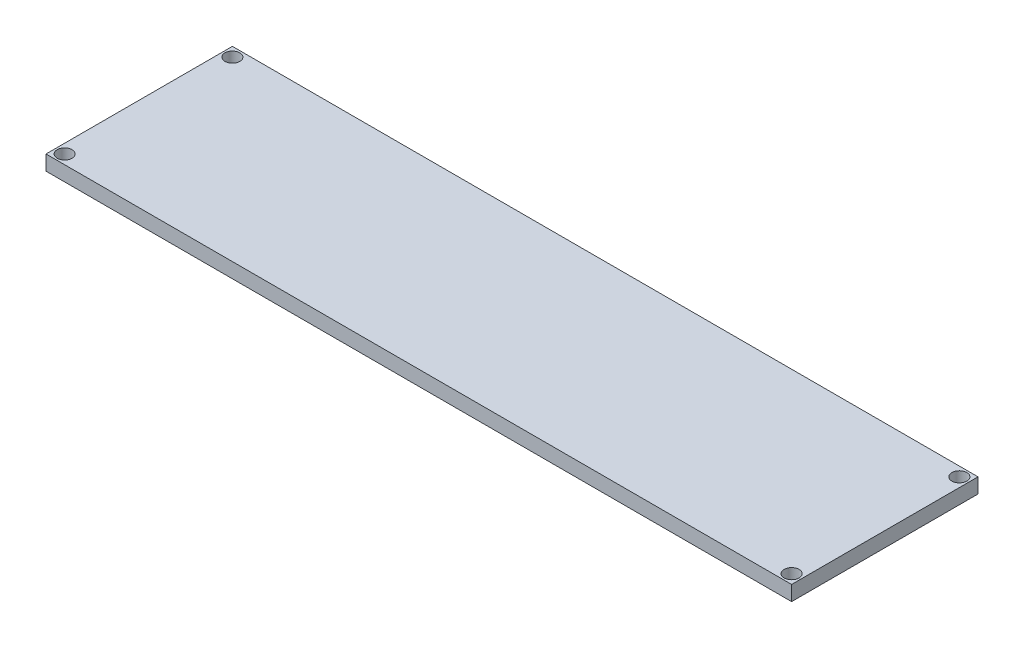
ISO-10303-21;
HEADER;
FILE_DESCRIPTION(('STEP AP214'),'2;1');
FILE_NAME('part.step','',(''),(''),'','','');
FILE_SCHEMA(('AUTOMOTIVE_DESIGN { 1 0 10303 214 1 1 1 1 }'));
ENDSEC;
DATA;
#1=APPLICATION_CONTEXT('core data for automotive mechanical design processes');
#2=APPLICATION_PROTOCOL_DEFINITION('international standard','automotive_design',2000,#1);
#3=PRODUCT_CONTEXT('',#1,'mechanical');
#4=PRODUCT('Part','Part','',(#3));
#5=PRODUCT_RELATED_PRODUCT_CATEGORY('part','',(#4));
#6=PRODUCT_DEFINITION_FORMATION('','',#4);
#7=PRODUCT_DEFINITION_CONTEXT('part definition',#1,'design');
#8=PRODUCT_DEFINITION('design','',#6,#7);
#9=PRODUCT_DEFINITION_SHAPE('','',#8);
#10=(LENGTH_UNIT() NAMED_UNIT(*) SI_UNIT(.MILLI.,.METRE.));
#11=(NAMED_UNIT(*) PLANE_ANGLE_UNIT() SI_UNIT($,.RADIAN.));
#12=(NAMED_UNIT(*) SI_UNIT($,.STERADIAN.) SOLID_ANGLE_UNIT());
#13=UNCERTAINTY_MEASURE_WITH_UNIT(LENGTH_MEASURE(1.E-05),#10,'distance_accuracy_value','');
#14=(GEOMETRIC_REPRESENTATION_CONTEXT(3) GLOBAL_UNCERTAINTY_ASSIGNED_CONTEXT((#13)) GLOBAL_UNIT_ASSIGNED_CONTEXT((#10,
#11,#12)) REPRESENTATION_CONTEXT('',''));
#15=CARTESIAN_POINT('',(0.,0.,0.));
#16=DIRECTION('',(0.,0.,1.));
#17=DIRECTION('',(1.,0.,0.));
#18=AXIS2_PLACEMENT_3D('',#15,#16,#17);
#19=CARTESIAN_POINT('',(0.,1.6,0.));
#20=DIRECTION('',(0.,0.,-1.));
#21=DIRECTION('',(-1.,0.,0.));
#22=AXIS2_PLACEMENT_3D('',#19,#20,#21);
#23=PLANE('',#22);
#24=DIRECTION('',(1.,0.,0.));
#25=VECTOR('',#24,1.);
#26=CARTESIAN_POINT('',(0.,0.,0.));
#27=LINE('',#26,#25);
#28=CARTESIAN_POINT('',(0.,0.,0.));
#29=VERTEX_POINT('',#28);
#30=CARTESIAN_POINT('',(80.,0.,0.));
#31=VERTEX_POINT('',#30);
#32=EDGE_CURVE('E130',#29,#31,#27,.T.);
#33=ORIENTED_EDGE('',*,*,#32,.T.);
#34=DIRECTION('',(0.,-1.,0.));
#35=VECTOR('',#34,1.);
#36=CARTESIAN_POINT('',(80.,1.6,0.));
#37=LINE('',#36,#35);
#38=CARTESIAN_POINT('',(80.,1.6,0.));
#39=VERTEX_POINT('',#38);
#40=EDGE_CURVE('E11',#39,#31,#37,.T.);
#41=ORIENTED_EDGE('',*,*,#40,.F.);
#42=DIRECTION('',(1.,0.,0.));
#43=VECTOR('',#42,1.);
#44=CARTESIAN_POINT('',(0.,1.6,0.));
#45=LINE('',#44,#43);
#46=CARTESIAN_POINT('',(0.,1.6,0.));
#47=VERTEX_POINT('',#46);
#48=EDGE_CURVE('E96',#47,#39,#45,.T.);
#49=ORIENTED_EDGE('',*,*,#48,.F.);
#50=DIRECTION('',(0.,-1.,0.));
#51=VECTOR('',#50,1.);
#52=CARTESIAN_POINT('',(0.,1.6,0.));
#53=LINE('',#52,#51);
#54=EDGE_CURVE('E63',#47,#29,#53,.T.);
#55=ORIENTED_EDGE('',*,*,#54,.T.);
#56=EDGE_LOOP('',(#33,#41,#49,#55));
#57=FACE_BOUND('',#56,.T.);
#58=ADVANCED_FACE('F45',(#57),#23,.F.);
#59=CARTESIAN_POINT('',(80.,1.6,0.));
#60=DIRECTION('',(-1.,0.,0.));
#61=DIRECTION('',(0.,0.,1.));
#62=AXIS2_PLACEMENT_3D('',#59,#60,#61);
#63=PLANE('',#62);
#64=DIRECTION('',(0.,0.,-1.));
#65=VECTOR('',#64,1.);
#66=CARTESIAN_POINT('',(80.,0.,0.));
#67=LINE('',#66,#65);
#68=CARTESIAN_POINT('',(80.,0.,-20.));
#69=VERTEX_POINT('',#68);
#70=EDGE_CURVE('E102',#31,#69,#67,.T.);
#71=ORIENTED_EDGE('',*,*,#70,.T.);
#72=DIRECTION('',(0.,-1.,0.));
#73=VECTOR('',#72,1.);
#74=CARTESIAN_POINT('',(80.,1.6,-20.));
#75=LINE('',#74,#73);
#76=CARTESIAN_POINT('',(80.,1.6,-20.));
#77=VERTEX_POINT('',#76);
#78=EDGE_CURVE('E55',#77,#69,#75,.T.);
#79=ORIENTED_EDGE('',*,*,#78,.F.);
#80=DIRECTION('',(0.,0.,-1.));
#81=VECTOR('',#80,1.);
#82=CARTESIAN_POINT('',(80.,1.6,0.));
#83=LINE('',#82,#81);
#84=EDGE_CURVE('E88',#39,#77,#83,.T.);
#85=ORIENTED_EDGE('',*,*,#84,.F.);
#86=ORIENTED_EDGE('',*,*,#40,.T.);
#87=EDGE_LOOP('',(#71,#79,#85,#86));
#88=FACE_BOUND('',#87,.T.);
#89=ADVANCED_FACE('F101',(#88),#63,.F.);
#90=CARTESIAN_POINT('',(0.,1.6,-20.));
#91=DIRECTION('',(0.,0.,-1.));
#92=DIRECTION('',(-1.,0.,0.));
#93=AXIS2_PLACEMENT_3D('',#90,#91,#92);
#94=PLANE('',#93);
#95=DIRECTION('',(1.,0.,0.));
#96=VECTOR('',#95,1.);
#97=CARTESIAN_POINT('',(0.,0.,-20.));
#98=LINE('',#97,#96);
#99=CARTESIAN_POINT('',(0.,0.,-20.));
#100=VERTEX_POINT('',#99);
#101=EDGE_CURVE('E135',#100,#69,#98,.T.);
#102=ORIENTED_EDGE('',*,*,#101,.F.);
#103=DIRECTION('',(0.,-1.,0.));
#104=VECTOR('',#103,1.);
#105=CARTESIAN_POINT('',(0.,1.6,-20.));
#106=LINE('',#105,#104);
#107=CARTESIAN_POINT('',(0.,1.6,-20.));
#108=VERTEX_POINT('',#107);
#109=EDGE_CURVE('E77',#108,#100,#106,.T.);
#110=ORIENTED_EDGE('',*,*,#109,.F.);
#111=DIRECTION('',(1.,0.,0.));
#112=VECTOR('',#111,1.);
#113=CARTESIAN_POINT('',(0.,1.6,-20.));
#114=LINE('',#113,#112);
#115=EDGE_CURVE('E95',#108,#77,#114,.T.);
#116=ORIENTED_EDGE('',*,*,#115,.T.);
#117=ORIENTED_EDGE('',*,*,#78,.T.);
#118=EDGE_LOOP('',(#102,#110,#116,#117));
#119=FACE_BOUND('',#118,.T.);
#120=ADVANCED_FACE('F106',(#119),#94,.T.);
#121=CARTESIAN_POINT('',(1.00000000000004,1.6,-19.));
#122=DIRECTION('',(0.,-1.,0.));
#123=DIRECTION('',(0.,0.,-1.));
#124=AXIS2_PLACEMENT_3D('',#121,#122,#123);
#125=CYLINDRICAL_SURFACE('',#124,0.8);
#126=CARTESIAN_POINT('',(1.00000000000004,1.6,-19.));
#127=DIRECTION('',(0.,1.,0.));
#128=DIRECTION('',(0.,0.,1.));
#129=AXIS2_PLACEMENT_3D('',#126,#127,#128);
#130=CIRCLE('',#129,0.8);
#131=CARTESIAN_POINT('',(1.00000000000004,1.6,-18.2));
#132=VERTEX_POINT('',#131);
#133=EDGE_CURVE('E161',#132,#132,#130,.T.);
#134=ORIENTED_EDGE('',*,*,#133,.T.);
#135=EDGE_LOOP('',(#134));
#136=FACE_BOUND('',#135,.T.);
#137=CARTESIAN_POINT('',(1.00000000000004,0.,-19.));
#138=DIRECTION('',(0.,1.,0.));
#139=DIRECTION('',(0.,0.,1.));
#140=AXIS2_PLACEMENT_3D('',#137,#138,#139);
#141=CIRCLE('',#140,0.8);
#142=CARTESIAN_POINT('',(1.00000000000004,0.,-18.2));
#143=VERTEX_POINT('',#142);
#144=EDGE_CURVE('E126',#143,#143,#141,.T.);
#145=ORIENTED_EDGE('',*,*,#144,.F.);
#146=EDGE_LOOP('',(#145));
#147=FACE_BOUND('',#146,.T.);
#148=ADVANCED_FACE('F167',(#136,#147),#125,.F.);
#149=CARTESIAN_POINT('',(1.00000000000004,1.6,-1.00000000000005));
#150=DIRECTION('',(0.,-1.,0.));
#151=DIRECTION('',(0.,0.,-1.));
#152=AXIS2_PLACEMENT_3D('',#149,#150,#151);
#153=CYLINDRICAL_SURFACE('',#152,0.8);
#154=CARTESIAN_POINT('',(1.00000000000004,1.6,-1.00000000000005));
#155=DIRECTION('',(0.,1.,0.));
#156=DIRECTION('',(0.,0.,1.));
#157=AXIS2_PLACEMENT_3D('',#154,#155,#156);
#158=CIRCLE('',#157,0.8);
#159=CARTESIAN_POINT('',(1.00000000000004,1.6,-0.200000000000046));
#160=VERTEX_POINT('',#159);
#161=EDGE_CURVE('E155',#160,#160,#158,.T.);
#162=ORIENTED_EDGE('',*,*,#161,.T.);
#163=EDGE_LOOP('',(#162));
#164=FACE_BOUND('',#163,.T.);
#165=CARTESIAN_POINT('',(1.00000000000004,0.,-1.00000000000005));
#166=DIRECTION('',(0.,1.,0.));
#167=DIRECTION('',(0.,0.,1.));
#168=AXIS2_PLACEMENT_3D('',#165,#166,#167);
#169=CIRCLE('',#168,0.8);
#170=CARTESIAN_POINT('',(1.00000000000004,0.,-0.200000000000046));
#171=VERTEX_POINT('',#170);
#172=EDGE_CURVE('E122',#171,#171,#169,.T.);
#173=ORIENTED_EDGE('',*,*,#172,.F.);
#174=EDGE_LOOP('',(#173));
#175=FACE_BOUND('',#174,.T.);
#176=ADVANCED_FACE('F193',(#164,#175),#153,.F.);
#177=CARTESIAN_POINT('',(79.,1.6,-1.));
#178=DIRECTION('',(0.,-1.,0.));
#179=DIRECTION('',(0.,0.,-1.));
#180=AXIS2_PLACEMENT_3D('',#177,#178,#179);
#181=CYLINDRICAL_SURFACE('',#180,0.799999999999995);
#182=CARTESIAN_POINT('',(79.,1.6,-1.));
#183=DIRECTION('',(0.,1.,0.));
#184=DIRECTION('',(0.,0.,1.));
#185=AXIS2_PLACEMENT_3D('',#182,#183,#184);
#186=CIRCLE('',#185,0.799999999999995);
#187=CARTESIAN_POINT('',(79.,1.6,-0.200000000000004));
#188=VERTEX_POINT('',#187);
#189=EDGE_CURVE('E149',#188,#188,#186,.T.);
#190=ORIENTED_EDGE('',*,*,#189,.T.);
#191=EDGE_LOOP('',(#190));
#192=FACE_BOUND('',#191,.T.);
#193=CARTESIAN_POINT('',(79.,0.,-1.));
#194=DIRECTION('',(0.,1.,0.));
#195=DIRECTION('',(0.,0.,1.));
#196=AXIS2_PLACEMENT_3D('',#193,#194,#195);
#197=CIRCLE('',#196,0.799999999999995);
#198=CARTESIAN_POINT('',(79.,0.,-0.200000000000004));
#199=VERTEX_POINT('',#198);
#200=EDGE_CURVE('E118',#199,#199,#197,.T.);
#201=ORIENTED_EDGE('',*,*,#200,.F.);
#202=EDGE_LOOP('',(#201));
#203=FACE_BOUND('',#202,.T.);
#204=ADVANCED_FACE('F195',(#192,#203),#181,.F.);
#205=CARTESIAN_POINT('',(79.,1.6,-19.));
#206=DIRECTION('',(0.,-1.,0.));
#207=DIRECTION('',(0.,0.,-1.));
#208=AXIS2_PLACEMENT_3D('',#205,#206,#207);
#209=CYLINDRICAL_SURFACE('',#208,0.799999999999995);
#210=CARTESIAN_POINT('',(79.,1.6,-19.));
#211=DIRECTION('',(0.,1.,0.));
#212=DIRECTION('',(0.,0.,1.));
#213=AXIS2_PLACEMENT_3D('',#210,#211,#212);
#214=CIRCLE('',#213,0.799999999999995);
#215=CARTESIAN_POINT('',(79.,1.6,-18.2));
#216=VERTEX_POINT('',#215);
#217=EDGE_CURVE('E142',#216,#216,#214,.T.);
#218=ORIENTED_EDGE('',*,*,#217,.T.);
#219=EDGE_LOOP('',(#218));
#220=FACE_BOUND('',#219,.T.);
#221=CARTESIAN_POINT('',(79.,0.,-19.));
#222=DIRECTION('',(0.,1.,0.));
#223=DIRECTION('',(0.,0.,1.));
#224=AXIS2_PLACEMENT_3D('',#221,#222,#223);
#225=CIRCLE('',#224,0.799999999999995);
#226=CARTESIAN_POINT('',(79.,0.,-18.2));
#227=VERTEX_POINT('',#226);
#228=EDGE_CURVE('E114',#227,#227,#225,.T.);
#229=ORIENTED_EDGE('',*,*,#228,.F.);
#230=EDGE_LOOP('',(#229));
#231=FACE_BOUND('',#230,.T.);
#232=ADVANCED_FACE('F47',(#220,#231),#209,.F.);
#233=CARTESIAN_POINT('',(0.,1.6,0.));
#234=DIRECTION('',(-1.,0.,0.));
#235=DIRECTION('',(0.,0.,1.));
#236=AXIS2_PLACEMENT_3D('',#233,#234,#235);
#237=PLANE('',#236);
#238=DIRECTION('',(0.,0.,-1.));
#239=VECTOR('',#238,1.);
#240=CARTESIAN_POINT('',(0.,0.,0.));
#241=LINE('',#240,#239);
#242=EDGE_CURVE('E138',#29,#100,#241,.T.);
#243=ORIENTED_EDGE('',*,*,#242,.F.);
#244=ORIENTED_EDGE('',*,*,#54,.F.);
#245=DIRECTION('',(0.,0.,-1.));
#246=VECTOR('',#245,1.);
#247=CARTESIAN_POINT('',(0.,1.6,0.));
#248=LINE('',#247,#246);
#249=EDGE_CURVE('E108',#47,#108,#248,.T.);
#250=ORIENTED_EDGE('',*,*,#249,.T.);
#251=ORIENTED_EDGE('',*,*,#109,.T.);
#252=EDGE_LOOP('',(#243,#244,#250,#251));
#253=FACE_BOUND('',#252,.T.);
#254=ADVANCED_FACE('F172',(#253),#237,.T.);
#255=CARTESIAN_POINT('',(0.,1.6,0.));
#256=DIRECTION('',(0.,1.,0.));
#257=DIRECTION('',(0.,0.,1.));
#258=AXIS2_PLACEMENT_3D('',#255,#256,#257);
#259=PLANE('',#258);
#260=ORIENTED_EDGE('',*,*,#217,.F.);
#261=EDGE_LOOP('',(#260));
#262=FACE_BOUND('',#261,.T.);
#263=ORIENTED_EDGE('',*,*,#189,.F.);
#264=EDGE_LOOP('',(#263));
#265=FACE_BOUND('',#264,.T.);
#266=ORIENTED_EDGE('',*,*,#161,.F.);
#267=EDGE_LOOP('',(#266));
#268=FACE_BOUND('',#267,.T.);
#269=ORIENTED_EDGE('',*,*,#133,.F.);
#270=EDGE_LOOP('',(#269));
#271=FACE_BOUND('',#270,.T.);
#272=ORIENTED_EDGE('',*,*,#48,.T.);
#273=ORIENTED_EDGE('',*,*,#84,.T.);
#274=ORIENTED_EDGE('',*,*,#115,.F.);
#275=ORIENTED_EDGE('',*,*,#249,.F.);
#276=EDGE_LOOP('',(#272,#273,#274,#275));
#277=FACE_BOUND('',#276,.T.);
#278=ADVANCED_FACE('F92',(#262,#265,#268,#271,#277),#259,.T.);
#279=CARTESIAN_POINT('',(0.,0.,0.));
#280=DIRECTION('',(0.,1.,0.));
#281=DIRECTION('',(0.,0.,1.));
#282=AXIS2_PLACEMENT_3D('',#279,#280,#281);
#283=PLANE('',#282);
#284=ORIENTED_EDGE('',*,*,#228,.T.);
#285=EDGE_LOOP('',(#284));
#286=FACE_BOUND('',#285,.T.);
#287=ORIENTED_EDGE('',*,*,#200,.T.);
#288=EDGE_LOOP('',(#287));
#289=FACE_BOUND('',#288,.T.);
#290=ORIENTED_EDGE('',*,*,#172,.T.);
#291=EDGE_LOOP('',(#290));
#292=FACE_BOUND('',#291,.T.);
#293=ORIENTED_EDGE('',*,*,#144,.T.);
#294=EDGE_LOOP('',(#293));
#295=FACE_BOUND('',#294,.T.);
#296=ORIENTED_EDGE('',*,*,#32,.F.);
#297=ORIENTED_EDGE('',*,*,#242,.T.);
#298=ORIENTED_EDGE('',*,*,#101,.T.);
#299=ORIENTED_EDGE('',*,*,#70,.F.);
#300=EDGE_LOOP('',(#296,#297,#298,#299));
#301=FACE_BOUND('',#300,.T.);
#302=ADVANCED_FACE('F171',(#286,#289,#292,#295,#301),#283,.F.);
#303=CLOSED_SHELL('',(#58,#89,#120,#148,#176,#204,#232,#254,#278,#302));
#304=MANIFOLD_SOLID_BREP('B2',#303);
#305=ADVANCED_BREP_SHAPE_REPRESENTATION('',(#18,#304),#14);
#306=SHAPE_DEFINITION_REPRESENTATION(#9,#305);
ENDSEC;
END-ISO-10303-21;
